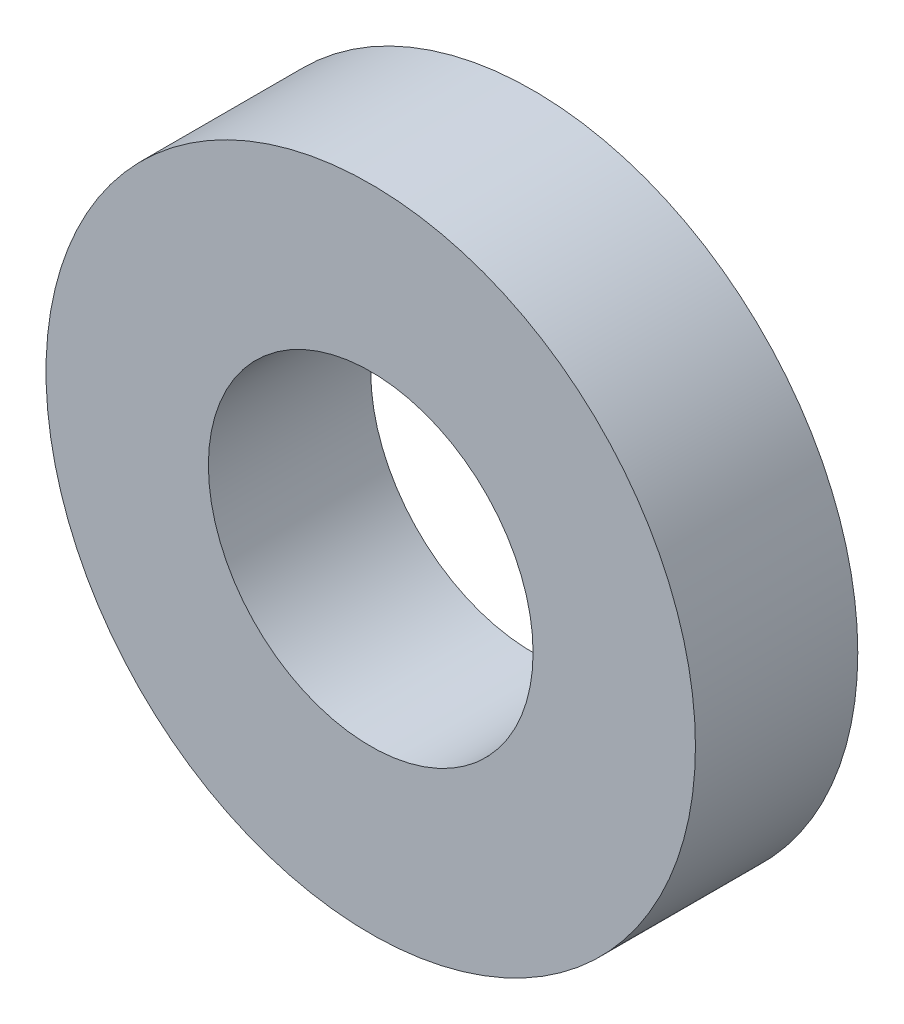
ISO-10303-21;
HEADER;
FILE_DESCRIPTION(('STEP AP214'),'2;1');
FILE_NAME('part.step','',(''),(''),'','','');
FILE_SCHEMA(('AUTOMOTIVE_DESIGN { 1 0 10303 214 1 1 1 1 }'));
ENDSEC;
DATA;
#1=APPLICATION_CONTEXT('core data for automotive mechanical design processes');
#2=APPLICATION_PROTOCOL_DEFINITION('international standard','automotive_design',2000,#1);
#3=PRODUCT_CONTEXT('',#1,'mechanical');
#4=PRODUCT('Part','Part','',(#3));
#5=PRODUCT_RELATED_PRODUCT_CATEGORY('part','',(#4));
#6=PRODUCT_DEFINITION_FORMATION('','',#4);
#7=PRODUCT_DEFINITION_CONTEXT('part definition',#1,'design');
#8=PRODUCT_DEFINITION('design','',#6,#7);
#9=PRODUCT_DEFINITION_SHAPE('','',#8);
#10=(LENGTH_UNIT() NAMED_UNIT(*) SI_UNIT(.MILLI.,.METRE.));
#11=(NAMED_UNIT(*) PLANE_ANGLE_UNIT() SI_UNIT($,.RADIAN.));
#12=(NAMED_UNIT(*) SI_UNIT($,.STERADIAN.) SOLID_ANGLE_UNIT());
#13=UNCERTAINTY_MEASURE_WITH_UNIT(LENGTH_MEASURE(1.E-05),#10,'distance_accuracy_value','');
#14=(GEOMETRIC_REPRESENTATION_CONTEXT(3) GLOBAL_UNCERTAINTY_ASSIGNED_CONTEXT((#13)) GLOBAL_UNIT_ASSIGNED_CONTEXT((#10,
#11,#12)) REPRESENTATION_CONTEXT('',''));
#15=CARTESIAN_POINT('',(0.,0.,0.));
#16=DIRECTION('',(0.,0.,1.));
#17=DIRECTION('',(1.,0.,0.));
#18=AXIS2_PLACEMENT_3D('',#15,#16,#17);
#19=CARTESIAN_POINT('',(0.,0.,4.));
#20=DIRECTION('',(0.,0.,1.));
#21=DIRECTION('',(1.,0.,0.));
#22=AXIS2_PLACEMENT_3D('',#19,#20,#21);
#23=PLANE('',#22);
#24=CARTESIAN_POINT('',(0.,0.,4.));
#25=DIRECTION('',(0.,0.,1.));
#26=DIRECTION('',(1.,0.,0.));
#27=AXIS2_PLACEMENT_3D('',#24,#25,#26);
#28=CIRCLE('',#27,8.);
#29=CARTESIAN_POINT('',(8.,0.,4.));
#30=VERTEX_POINT('',#29);
#31=EDGE_CURVE('E10',#30,#30,#28,.T.);
#32=ORIENTED_EDGE('',*,*,#31,.T.);
#33=EDGE_LOOP('',(#32));
#34=FACE_BOUND('',#33,.T.);
#35=CARTESIAN_POINT('',(0.,0.,4.));
#36=DIRECTION('',(0.,0.,1.));
#37=DIRECTION('',(1.,0.,0.));
#38=AXIS2_PLACEMENT_3D('',#35,#36,#37);
#39=CIRCLE('',#38,4.);
#40=CARTESIAN_POINT('',(4.,0.,4.));
#41=VERTEX_POINT('',#40);
#42=EDGE_CURVE('E58',#41,#41,#39,.T.);
#43=ORIENTED_EDGE('',*,*,#42,.F.);
#44=EDGE_LOOP('',(#43));
#45=FACE_BOUND('',#44,.T.);
#46=ADVANCED_FACE('F44',(#34,#45),#23,.T.);
#47=CARTESIAN_POINT('',(0.,0.,0.));
#48=DIRECTION('',(0.,0.,1.));
#49=DIRECTION('',(1.,0.,0.));
#50=AXIS2_PLACEMENT_3D('',#47,#48,#49);
#51=PLANE('',#50);
#52=CARTESIAN_POINT('',(0.,0.,0.));
#53=DIRECTION('',(0.,0.,1.));
#54=DIRECTION('',(1.,0.,0.));
#55=AXIS2_PLACEMENT_3D('',#52,#53,#54);
#56=CIRCLE('',#55,8.);
#57=CARTESIAN_POINT('',(8.,0.,0.));
#58=VERTEX_POINT('',#57);
#59=EDGE_CURVE('E47',#58,#58,#56,.T.);
#60=ORIENTED_EDGE('',*,*,#59,.F.);
#61=EDGE_LOOP('',(#60));
#62=FACE_BOUND('',#61,.T.);
#63=CARTESIAN_POINT('',(0.,0.,0.));
#64=DIRECTION('',(0.,0.,1.));
#65=DIRECTION('',(1.,0.,0.));
#66=AXIS2_PLACEMENT_3D('',#63,#64,#65);
#67=CIRCLE('',#66,4.);
#68=CARTESIAN_POINT('',(4.,0.,0.));
#69=VERTEX_POINT('',#68);
#70=EDGE_CURVE('E65',#69,#69,#67,.T.);
#71=ORIENTED_EDGE('',*,*,#70,.T.);
#72=EDGE_LOOP('',(#71));
#73=FACE_BOUND('',#72,.T.);
#74=ADVANCED_FACE('F72',(#62,#73),#51,.F.);
#75=CARTESIAN_POINT('',(0.,0.,4.));
#76=DIRECTION('',(0.,0.,-1.));
#77=DIRECTION('',(-1.,0.,0.));
#78=AXIS2_PLACEMENT_3D('',#75,#76,#77);
#79=CYLINDRICAL_SURFACE('',#78,8.);
#80=ORIENTED_EDGE('',*,*,#31,.F.);
#81=EDGE_LOOP('',(#80));
#82=FACE_BOUND('',#81,.T.);
#83=ORIENTED_EDGE('',*,*,#59,.T.);
#84=EDGE_LOOP('',(#83));
#85=FACE_BOUND('',#84,.T.);
#86=ADVANCED_FACE('F50',(#82,#85),#79,.T.);
#87=CARTESIAN_POINT('',(0.,0.,4.));
#88=DIRECTION('',(0.,0.,-1.));
#89=DIRECTION('',(-1.,0.,0.));
#90=AXIS2_PLACEMENT_3D('',#87,#88,#89);
#91=CYLINDRICAL_SURFACE('',#90,4.);
#92=ORIENTED_EDGE('',*,*,#42,.T.);
#93=EDGE_LOOP('',(#92));
#94=FACE_BOUND('',#93,.T.);
#95=ORIENTED_EDGE('',*,*,#70,.F.);
#96=EDGE_LOOP('',(#95));
#97=FACE_BOUND('',#96,.T.);
#98=ADVANCED_FACE('F73',(#94,#97),#91,.F.);
#99=CLOSED_SHELL('',(#46,#74,#86,#98));
#100=MANIFOLD_SOLID_BREP('B2',#99);
#101=ADVANCED_BREP_SHAPE_REPRESENTATION('',(#18,#100),#14);
#102=SHAPE_DEFINITION_REPRESENTATION(#9,#101);
ENDSEC;
END-ISO-10303-21;
